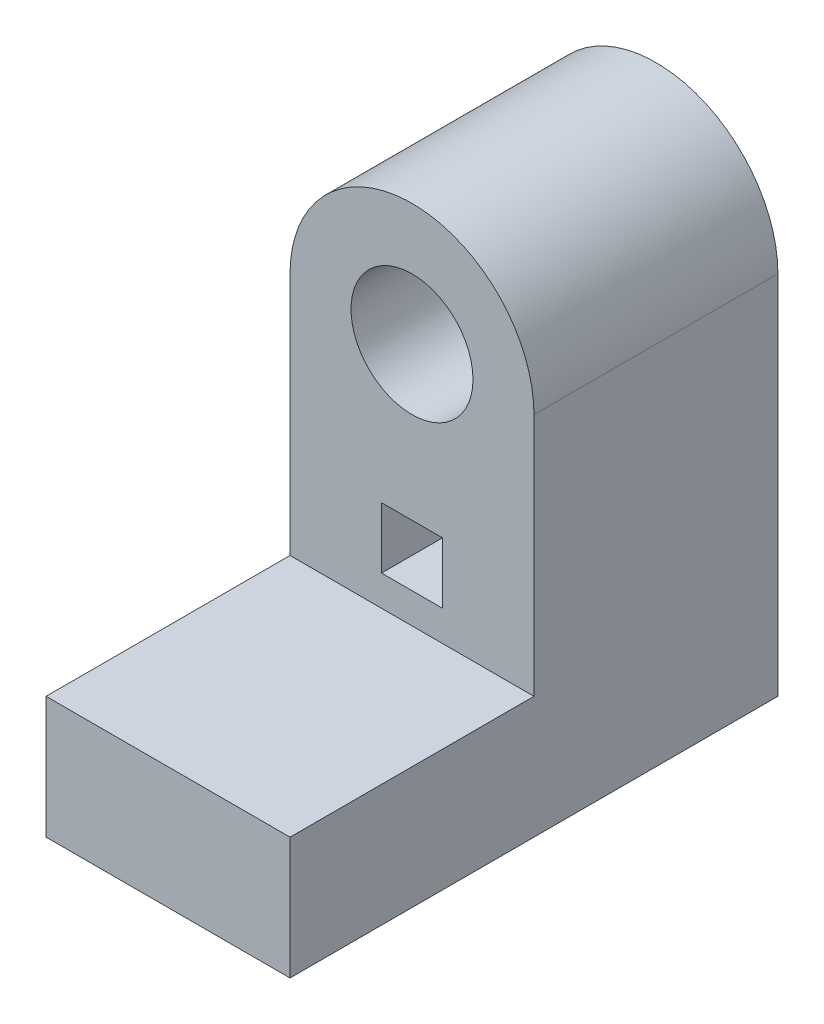
ISO-10303-21;
HEADER;
FILE_DESCRIPTION(('STEP AP214'),'2;1');
FILE_NAME('part.step','',(''),(''),'','','');
FILE_SCHEMA(('AUTOMOTIVE_DESIGN { 1 0 10303 214 1 1 1 1 }'));
ENDSEC;
DATA;
#1=APPLICATION_CONTEXT('core data for automotive mechanical design processes');
#2=APPLICATION_PROTOCOL_DEFINITION('international standard','automotive_design',2000,#1);
#3=PRODUCT_CONTEXT('',#1,'mechanical');
#4=PRODUCT('Part','Part','',(#3));
#5=PRODUCT_RELATED_PRODUCT_CATEGORY('part','',(#4));
#6=PRODUCT_DEFINITION_FORMATION('','',#4);
#7=PRODUCT_DEFINITION_CONTEXT('part definition',#1,'design');
#8=PRODUCT_DEFINITION('design','',#6,#7);
#9=PRODUCT_DEFINITION_SHAPE('','',#8);
#10=(LENGTH_UNIT() NAMED_UNIT(*) SI_UNIT(.MILLI.,.METRE.));
#11=(NAMED_UNIT(*) PLANE_ANGLE_UNIT() SI_UNIT($,.RADIAN.));
#12=(NAMED_UNIT(*) SI_UNIT($,.STERADIAN.) SOLID_ANGLE_UNIT());
#13=UNCERTAINTY_MEASURE_WITH_UNIT(LENGTH_MEASURE(1.E-05),#10,'distance_accuracy_value','');
#14=(GEOMETRIC_REPRESENTATION_CONTEXT(3) GLOBAL_UNCERTAINTY_ASSIGNED_CONTEXT((#13)) GLOBAL_UNIT_ASSIGNED_CONTEXT((#10,
#11,#12)) REPRESENTATION_CONTEXT('',''));
#15=CARTESIAN_POINT('',(0.,0.,0.));
#16=DIRECTION('',(0.,0.,1.));
#17=DIRECTION('',(1.,0.,0.));
#18=AXIS2_PLACEMENT_3D('',#15,#16,#17);
#19=CARTESIAN_POINT('',(25.4,76.2,50.8));
#20=DIRECTION('',(0.,0.,1.));
#21=DIRECTION('',(1.,0.,0.));
#22=AXIS2_PLACEMENT_3D('',#19,#20,#21);
#23=PLANE('',#22);
#24=CARTESIAN_POINT('',(25.4,76.2,50.8));
#25=DIRECTION('',(0.,0.,1.));
#26=DIRECTION('',(1.,0.,0.));
#27=AXIS2_PLACEMENT_3D('',#24,#25,#26);
#28=CIRCLE('',#27,12.7);
#29=CARTESIAN_POINT('',(38.1,76.2,50.8));
#30=VERTEX_POINT('',#29);
#31=EDGE_CURVE('E176',#30,#30,#28,.T.);
#32=ORIENTED_EDGE('',*,*,#31,.F.);
#33=EDGE_LOOP('',(#32));
#34=FACE_BOUND('',#33,.T.);
#35=DIRECTION('',(-1.,0.,0.));
#36=VECTOR('',#35,1.);
#37=CARTESIAN_POINT('',(19.05,44.45,50.8));
#38=LINE('',#37,#36);
#39=CARTESIAN_POINT('',(31.75,44.45,50.8));
#40=VERTEX_POINT('',#39);
#41=CARTESIAN_POINT('',(19.05,44.45,50.8));
#42=VERTEX_POINT('',#41);
#43=EDGE_CURVE('E149',#40,#42,#38,.T.);
#44=ORIENTED_EDGE('',*,*,#43,.F.);
#45=DIRECTION('',(0.,1.,0.));
#46=VECTOR('',#45,1.);
#47=CARTESIAN_POINT('',(31.75,44.45,50.8));
#48=LINE('',#47,#46);
#49=CARTESIAN_POINT('',(31.75,31.75,50.8));
#50=VERTEX_POINT('',#49);
#51=EDGE_CURVE('E147',#50,#40,#48,.T.);
#52=ORIENTED_EDGE('',*,*,#51,.F.);
#53=DIRECTION('',(1.,0.,0.));
#54=VECTOR('',#53,1.);
#55=CARTESIAN_POINT('',(19.05,31.75,50.8));
#56=LINE('',#55,#54);
#57=CARTESIAN_POINT('',(19.05,31.75,50.8));
#58=VERTEX_POINT('',#57);
#59=EDGE_CURVE('E154',#58,#50,#56,.T.);
#60=ORIENTED_EDGE('',*,*,#59,.F.);
#61=DIRECTION('',(0.,-1.,0.));
#62=VECTOR('',#61,1.);
#63=CARTESIAN_POINT('',(19.05,44.45,50.8));
#64=LINE('',#63,#62);
#65=EDGE_CURVE('E152',#42,#58,#64,.T.);
#66=ORIENTED_EDGE('',*,*,#65,.F.);
#67=EDGE_LOOP('',(#44,#52,#60,#66));
#68=FACE_BOUND('',#67,.T.);
#69=DIRECTION('',(0.,-1.,0.));
#70=VECTOR('',#69,1.);
#71=CARTESIAN_POINT('',(0.,76.2,50.8));
#72=LINE('',#71,#70);
#73=CARTESIAN_POINT('',(0.,76.2,50.8));
#74=VERTEX_POINT('',#73);
#75=CARTESIAN_POINT('',(0.,25.4,50.8));
#76=VERTEX_POINT('',#75);
#77=EDGE_CURVE('E187',#74,#76,#72,.T.);
#78=ORIENTED_EDGE('',*,*,#77,.T.);
#79=DIRECTION('',(1.,0.,0.));
#80=VECTOR('',#79,1.);
#81=CARTESIAN_POINT('',(25.4,25.4,50.8));
#82=LINE('',#81,#80);
#83=CARTESIAN_POINT('',(50.8,25.4,50.8));
#84=VERTEX_POINT('',#83);
#85=EDGE_CURVE('E144',#76,#84,#82,.T.);
#86=ORIENTED_EDGE('',*,*,#85,.T.);
#87=DIRECTION('',(0.,1.,0.));
#88=VECTOR('',#87,1.);
#89=CARTESIAN_POINT('',(50.8,25.4,50.8));
#90=LINE('',#89,#88);
#91=CARTESIAN_POINT('',(50.8,76.2,50.8));
#92=VERTEX_POINT('',#91);
#93=EDGE_CURVE('E182',#84,#92,#90,.T.);
#94=ORIENTED_EDGE('',*,*,#93,.T.);
#95=CARTESIAN_POINT('',(25.4,76.2,50.8));
#96=DIRECTION('',(0.,0.,1.));
#97=DIRECTION('',(1.,0.,0.));
#98=AXIS2_PLACEMENT_3D('',#95,#96,#97);
#99=CIRCLE('',#98,25.4);
#100=EDGE_CURVE('E184',#92,#74,#99,.T.);
#101=ORIENTED_EDGE('',*,*,#100,.T.);
#102=EDGE_LOOP('',(#78,#86,#94,#101));
#103=FACE_BOUND('',#102,.T.);
#104=ADVANCED_FACE('F35',(#34,#68,#103),#23,.T.);
#105=CARTESIAN_POINT('',(25.4,76.2,0.));
#106=DIRECTION('',(0.,0.,1.));
#107=DIRECTION('',(1.,0.,0.));
#108=AXIS2_PLACEMENT_3D('',#105,#106,#107);
#109=PLANE('',#108);
#110=DIRECTION('',(1.,0.,0.));
#111=VECTOR('',#110,1.);
#112=CARTESIAN_POINT('',(50.8,0.,0.));
#113=LINE('',#112,#111);
#114=CARTESIAN_POINT('',(0.,0.,0.));
#115=VERTEX_POINT('',#114);
#116=CARTESIAN_POINT('',(50.8,0.,0.));
#117=VERTEX_POINT('',#116);
#118=EDGE_CURVE('E185',#115,#117,#113,.T.);
#119=ORIENTED_EDGE('',*,*,#118,.F.);
#120=DIRECTION('',(0.,-1.,0.));
#121=VECTOR('',#120,1.);
#122=CARTESIAN_POINT('',(0.,0.,0.));
#123=LINE('',#122,#121);
#124=CARTESIAN_POINT('',(0.,76.2,0.));
#125=VERTEX_POINT('',#124);
#126=EDGE_CURVE('E120',#125,#115,#123,.T.);
#127=ORIENTED_EDGE('',*,*,#126,.F.);
#128=CARTESIAN_POINT('',(25.4,76.2,0.));
#129=DIRECTION('',(0.,0.,1.));
#130=DIRECTION('',(1.,0.,0.));
#131=AXIS2_PLACEMENT_3D('',#128,#129,#130);
#132=CIRCLE('',#131,25.4);
#133=CARTESIAN_POINT('',(50.8,76.2,0.));
#134=VERTEX_POINT('',#133);
#135=EDGE_CURVE('E191',#134,#125,#132,.T.);
#136=ORIENTED_EDGE('',*,*,#135,.F.);
#137=DIRECTION('',(0.,1.,0.));
#138=VECTOR('',#137,1.);
#139=CARTESIAN_POINT('',(50.8,25.4,0.));
#140=LINE('',#139,#138);
#141=EDGE_CURVE('E179',#117,#134,#140,.T.);
#142=ORIENTED_EDGE('',*,*,#141,.F.);
#143=EDGE_LOOP('',(#119,#127,#136,#142));
#144=FACE_BOUND('',#143,.T.);
#145=DIRECTION('',(0.,1.,0.));
#146=VECTOR('',#145,1.);
#147=CARTESIAN_POINT('',(31.75,44.45,0.));
#148=LINE('',#147,#146);
#149=CARTESIAN_POINT('',(31.75,31.75,0.));
#150=VERTEX_POINT('',#149);
#151=CARTESIAN_POINT('',(31.75,44.45,0.));
#152=VERTEX_POINT('',#151);
#153=EDGE_CURVE('E146',#150,#152,#148,.T.);
#154=ORIENTED_EDGE('',*,*,#153,.T.);
#155=DIRECTION('',(-1.,0.,0.));
#156=VECTOR('',#155,1.);
#157=CARTESIAN_POINT('',(19.05,44.45,0.));
#158=LINE('',#157,#156);
#159=CARTESIAN_POINT('',(19.05,44.45,0.));
#160=VERTEX_POINT('',#159);
#161=EDGE_CURVE('E159',#152,#160,#158,.T.);
#162=ORIENTED_EDGE('',*,*,#161,.T.);
#163=DIRECTION('',(0.,-1.,0.));
#164=VECTOR('',#163,1.);
#165=CARTESIAN_POINT('',(19.05,44.45,0.));
#166=LINE('',#165,#164);
#167=CARTESIAN_POINT('',(19.05,31.75,0.));
#168=VERTEX_POINT('',#167);
#169=EDGE_CURVE('E162',#160,#168,#166,.T.);
#170=ORIENTED_EDGE('',*,*,#169,.T.);
#171=DIRECTION('',(1.,0.,0.));
#172=VECTOR('',#171,1.);
#173=CARTESIAN_POINT('',(19.05,31.75,0.));
#174=LINE('',#173,#172);
#175=EDGE_CURVE('E150',#168,#150,#174,.T.);
#176=ORIENTED_EDGE('',*,*,#175,.T.);
#177=EDGE_LOOP('',(#154,#162,#170,#176));
#178=FACE_BOUND('',#177,.T.);
#179=CARTESIAN_POINT('',(25.4,76.2,0.));
#180=DIRECTION('',(0.,0.,1.));
#181=DIRECTION('',(1.,0.,0.));
#182=AXIS2_PLACEMENT_3D('',#179,#180,#181);
#183=CIRCLE('',#182,12.7);
#184=CARTESIAN_POINT('',(38.1,76.2,0.));
#185=VERTEX_POINT('',#184);
#186=EDGE_CURVE('E175',#185,#185,#183,.T.);
#187=ORIENTED_EDGE('',*,*,#186,.T.);
#188=EDGE_LOOP('',(#187));
#189=FACE_BOUND('',#188,.T.);
#190=ADVANCED_FACE('F204',(#144,#178,#189),#109,.F.);
#191=CARTESIAN_POINT('',(50.8,25.4,50.8));
#192=DIRECTION('',(-1.,0.,0.));
#193=DIRECTION('',(0.,0.,1.));
#194=AXIS2_PLACEMENT_3D('',#191,#192,#193);
#195=PLANE('',#194);
#196=ORIENTED_EDGE('',*,*,#141,.T.);
#197=DIRECTION('',(0.,0.,-1.));
#198=VECTOR('',#197,1.);
#199=CARTESIAN_POINT('',(50.8,76.2,50.8));
#200=LINE('',#199,#198);
#201=EDGE_CURVE('E11',#92,#134,#200,.T.);
#202=ORIENTED_EDGE('',*,*,#201,.F.);
#203=ORIENTED_EDGE('',*,*,#93,.F.);
#204=DIRECTION('',(0.,0.,-1.));
#205=VECTOR('',#204,1.);
#206=CARTESIAN_POINT('',(50.8,25.4,101.6));
#207=LINE('',#206,#205);
#208=CARTESIAN_POINT('',(50.8,25.4,101.6));
#209=VERTEX_POINT('',#208);
#210=EDGE_CURVE('E50',#209,#84,#207,.T.);
#211=ORIENTED_EDGE('',*,*,#210,.F.);
#212=DIRECTION('',(0.,1.,0.));
#213=VECTOR('',#212,1.);
#214=CARTESIAN_POINT('',(50.8,0.,101.6));
#215=LINE('',#214,#213);
#216=CARTESIAN_POINT('',(50.8,0.,101.6));
#217=VERTEX_POINT('',#216);
#218=EDGE_CURVE('E132',#217,#209,#215,.T.);
#219=ORIENTED_EDGE('',*,*,#218,.F.);
#220=DIRECTION('',(0.,0.,-1.));
#221=VECTOR('',#220,1.);
#222=CARTESIAN_POINT('',(50.8,0.,50.8));
#223=LINE('',#222,#221);
#224=EDGE_CURVE('E124',#217,#117,#223,.T.);
#225=ORIENTED_EDGE('',*,*,#224,.T.);
#226=EDGE_LOOP('',(#196,#202,#203,#211,#219,#225));
#227=FACE_BOUND('',#226,.T.);
#228=ADVANCED_FACE('F37',(#227),#195,.F.);
#229=CARTESIAN_POINT('',(25.4,76.2,50.8));
#230=DIRECTION('',(0.,0.,-1.));
#231=DIRECTION('',(-1.,0.,0.));
#232=AXIS2_PLACEMENT_3D('',#229,#230,#231);
#233=CYLINDRICAL_SURFACE('',#232,25.4);
#234=ORIENTED_EDGE('',*,*,#135,.T.);
#235=DIRECTION('',(0.,0.,-1.));
#236=VECTOR('',#235,1.);
#237=CARTESIAN_POINT('',(0.,76.2,50.8));
#238=LINE('',#237,#236);
#239=EDGE_CURVE('E43',#74,#125,#238,.T.);
#240=ORIENTED_EDGE('',*,*,#239,.F.);
#241=ORIENTED_EDGE('',*,*,#100,.F.);
#242=ORIENTED_EDGE('',*,*,#201,.T.);
#243=EDGE_LOOP('',(#234,#240,#241,#242));
#244=FACE_BOUND('',#243,.T.);
#245=ADVANCED_FACE('F200',(#244),#233,.T.);
#246=CARTESIAN_POINT('',(0.,0.,50.8));
#247=DIRECTION('',(1.,0.,0.));
#248=DIRECTION('',(0.,1.,0.));
#249=AXIS2_PLACEMENT_3D('',#246,#247,#248);
#250=PLANE('',#249);
#251=DIRECTION('',(0.,0.,-1.));
#252=VECTOR('',#251,1.);
#253=CARTESIAN_POINT('',(0.,0.,50.8));
#254=LINE('',#253,#252);
#255=CARTESIAN_POINT('',(0.,0.,101.6));
#256=VERTEX_POINT('',#255);
#257=EDGE_CURVE('E113',#256,#115,#254,.T.);
#258=ORIENTED_EDGE('',*,*,#257,.F.);
#259=DIRECTION('',(0.,-1.,0.));
#260=VECTOR('',#259,1.);
#261=CARTESIAN_POINT('',(0.,25.4,101.6));
#262=LINE('',#261,#260);
#263=CARTESIAN_POINT('',(0.,25.4,101.6));
#264=VERTEX_POINT('',#263);
#265=EDGE_CURVE('E118',#264,#256,#262,.T.);
#266=ORIENTED_EDGE('',*,*,#265,.F.);
#267=DIRECTION('',(0.,0.,-1.));
#268=VECTOR('',#267,1.);
#269=CARTESIAN_POINT('',(0.,25.4,101.6));
#270=LINE('',#269,#268);
#271=EDGE_CURVE('E141',#264,#76,#270,.T.);
#272=ORIENTED_EDGE('',*,*,#271,.T.);
#273=ORIENTED_EDGE('',*,*,#77,.F.);
#274=ORIENTED_EDGE('',*,*,#239,.T.);
#275=ORIENTED_EDGE('',*,*,#126,.T.);
#276=EDGE_LOOP('',(#258,#266,#272,#273,#274,#275));
#277=FACE_BOUND('',#276,.T.);
#278=ADVANCED_FACE('F115',(#277),#250,.F.);
#279=CARTESIAN_POINT('',(50.8,0.,50.8));
#280=DIRECTION('',(0.,1.,0.));
#281=DIRECTION('',(0.,0.,1.));
#282=AXIS2_PLACEMENT_3D('',#279,#280,#281);
#283=PLANE('',#282);
#284=ORIENTED_EDGE('',*,*,#118,.T.);
#285=ORIENTED_EDGE('',*,*,#224,.F.);
#286=DIRECTION('',(1.,0.,0.));
#287=VECTOR('',#286,1.);
#288=CARTESIAN_POINT('',(0.,0.,101.6));
#289=LINE('',#288,#287);
#290=EDGE_CURVE('E127',#256,#217,#289,.T.);
#291=ORIENTED_EDGE('',*,*,#290,.F.);
#292=ORIENTED_EDGE('',*,*,#257,.T.);
#293=EDGE_LOOP('',(#284,#285,#291,#292));
#294=FACE_BOUND('',#293,.T.);
#295=ADVANCED_FACE('F128',(#294),#283,.F.);
#296=CARTESIAN_POINT('',(25.4,76.2,50.8));
#297=DIRECTION('',(0.,0.,-1.));
#298=DIRECTION('',(-1.,0.,0.));
#299=AXIS2_PLACEMENT_3D('',#296,#297,#298);
#300=CYLINDRICAL_SURFACE('',#299,12.7);
#301=ORIENTED_EDGE('',*,*,#31,.T.);
#302=EDGE_LOOP('',(#301));
#303=FACE_BOUND('',#302,.T.);
#304=ORIENTED_EDGE('',*,*,#186,.F.);
#305=EDGE_LOOP('',(#304));
#306=FACE_BOUND('',#305,.T.);
#307=ADVANCED_FACE('F220',(#303,#306),#300,.F.);
#308=CARTESIAN_POINT('',(31.75,44.45,50.8));
#309=DIRECTION('',(-1.,0.,0.));
#310=DIRECTION('',(0.,0.,1.));
#311=AXIS2_PLACEMENT_3D('',#308,#309,#310);
#312=PLANE('',#311);
#313=ORIENTED_EDGE('',*,*,#153,.F.);
#314=DIRECTION('',(0.,0.,-1.));
#315=VECTOR('',#314,1.);
#316=CARTESIAN_POINT('',(31.75,31.75,50.8));
#317=LINE('',#316,#315);
#318=EDGE_CURVE('E156',#50,#150,#317,.T.);
#319=ORIENTED_EDGE('',*,*,#318,.F.);
#320=ORIENTED_EDGE('',*,*,#51,.T.);
#321=DIRECTION('',(0.,0.,-1.));
#322=VECTOR('',#321,1.);
#323=CARTESIAN_POINT('',(31.75,44.45,50.8));
#324=LINE('',#323,#322);
#325=EDGE_CURVE('E172',#40,#152,#324,.T.);
#326=ORIENTED_EDGE('',*,*,#325,.T.);
#327=EDGE_LOOP('',(#313,#319,#320,#326));
#328=FACE_BOUND('',#327,.T.);
#329=ADVANCED_FACE('F272',(#328),#312,.T.);
#330=CARTESIAN_POINT('',(19.05,44.45,50.8));
#331=DIRECTION('',(0.,-1.,0.));
#332=DIRECTION('',(0.,0.,-1.));
#333=AXIS2_PLACEMENT_3D('',#330,#331,#332);
#334=PLANE('',#333);
#335=ORIENTED_EDGE('',*,*,#161,.F.);
#336=ORIENTED_EDGE('',*,*,#325,.F.);
#337=ORIENTED_EDGE('',*,*,#43,.T.);
#338=DIRECTION('',(0.,0.,-1.));
#339=VECTOR('',#338,1.);
#340=CARTESIAN_POINT('',(19.05,44.45,50.8));
#341=LINE('',#340,#339);
#342=EDGE_CURVE('E170',#42,#160,#341,.T.);
#343=ORIENTED_EDGE('',*,*,#342,.T.);
#344=EDGE_LOOP('',(#335,#336,#337,#343));
#345=FACE_BOUND('',#344,.T.);
#346=ADVANCED_FACE('F262',(#345),#334,.T.);
#347=CARTESIAN_POINT('',(19.05,44.45,50.8));
#348=DIRECTION('',(1.,0.,0.));
#349=DIRECTION('',(0.,0.,-1.));
#350=AXIS2_PLACEMENT_3D('',#347,#348,#349);
#351=PLANE('',#350);
#352=ORIENTED_EDGE('',*,*,#169,.F.);
#353=ORIENTED_EDGE('',*,*,#342,.F.);
#354=ORIENTED_EDGE('',*,*,#65,.T.);
#355=DIRECTION('',(0.,0.,-1.));
#356=VECTOR('',#355,1.);
#357=CARTESIAN_POINT('',(19.05,31.75,50.8));
#358=LINE('',#357,#356);
#359=EDGE_CURVE('E58',#58,#168,#358,.T.);
#360=ORIENTED_EDGE('',*,*,#359,.T.);
#361=EDGE_LOOP('',(#352,#353,#354,#360));
#362=FACE_BOUND('',#361,.T.);
#363=ADVANCED_FACE('F252',(#362),#351,.T.);
#364=CARTESIAN_POINT('',(19.05,31.75,50.8));
#365=DIRECTION('',(0.,1.,0.));
#366=DIRECTION('',(0.,0.,1.));
#367=AXIS2_PLACEMENT_3D('',#364,#365,#366);
#368=PLANE('',#367);
#369=ORIENTED_EDGE('',*,*,#175,.F.);
#370=ORIENTED_EDGE('',*,*,#359,.F.);
#371=ORIENTED_EDGE('',*,*,#59,.T.);
#372=ORIENTED_EDGE('',*,*,#318,.T.);
#373=EDGE_LOOP('',(#369,#370,#371,#372));
#374=FACE_BOUND('',#373,.T.);
#375=ADVANCED_FACE('F248',(#374),#368,.T.);
#376=CARTESIAN_POINT('',(50.8,25.4,101.6));
#377=DIRECTION('',(0.,-1.,0.));
#378=DIRECTION('',(1.,0.,0.));
#379=AXIS2_PLACEMENT_3D('',#376,#377,#378);
#380=PLANE('',#379);
#381=ORIENTED_EDGE('',*,*,#85,.F.);
#382=ORIENTED_EDGE('',*,*,#271,.F.);
#383=DIRECTION('',(-1.,0.,0.));
#384=VECTOR('',#383,1.);
#385=CARTESIAN_POINT('',(50.8,25.4,101.6));
#386=LINE('',#385,#384);
#387=EDGE_CURVE('E135',#209,#264,#386,.T.);
#388=ORIENTED_EDGE('',*,*,#387,.F.);
#389=ORIENTED_EDGE('',*,*,#210,.T.);
#390=EDGE_LOOP('',(#381,#382,#388,#389));
#391=FACE_BOUND('',#390,.T.);
#392=ADVANCED_FACE('F208',(#391),#380,.F.);
#393=CARTESIAN_POINT('',(0.,0.,101.6));
#394=DIRECTION('',(0.,0.,1.));
#395=DIRECTION('',(1.,0.,0.));
#396=AXIS2_PLACEMENT_3D('',#393,#394,#395);
#397=PLANE('',#396);
#398=ORIENTED_EDGE('',*,*,#265,.T.);
#399=ORIENTED_EDGE('',*,*,#290,.T.);
#400=ORIENTED_EDGE('',*,*,#218,.T.);
#401=ORIENTED_EDGE('',*,*,#387,.T.);
#402=EDGE_LOOP('',(#398,#399,#400,#401));
#403=FACE_BOUND('',#402,.T.);
#404=ADVANCED_FACE('F134',(#403),#397,.T.);
#405=CLOSED_SHELL('',(#104,#190,#228,#245,#278,#295,#307,#329,#346,#363,#375,#392,#404));
#406=MANIFOLD_SOLID_BREP('B2',#405);
#407=ADVANCED_BREP_SHAPE_REPRESENTATION('',(#18,#406),#14);
#408=SHAPE_DEFINITION_REPRESENTATION(#9,#407);
ENDSEC;
END-ISO-10303-21;
